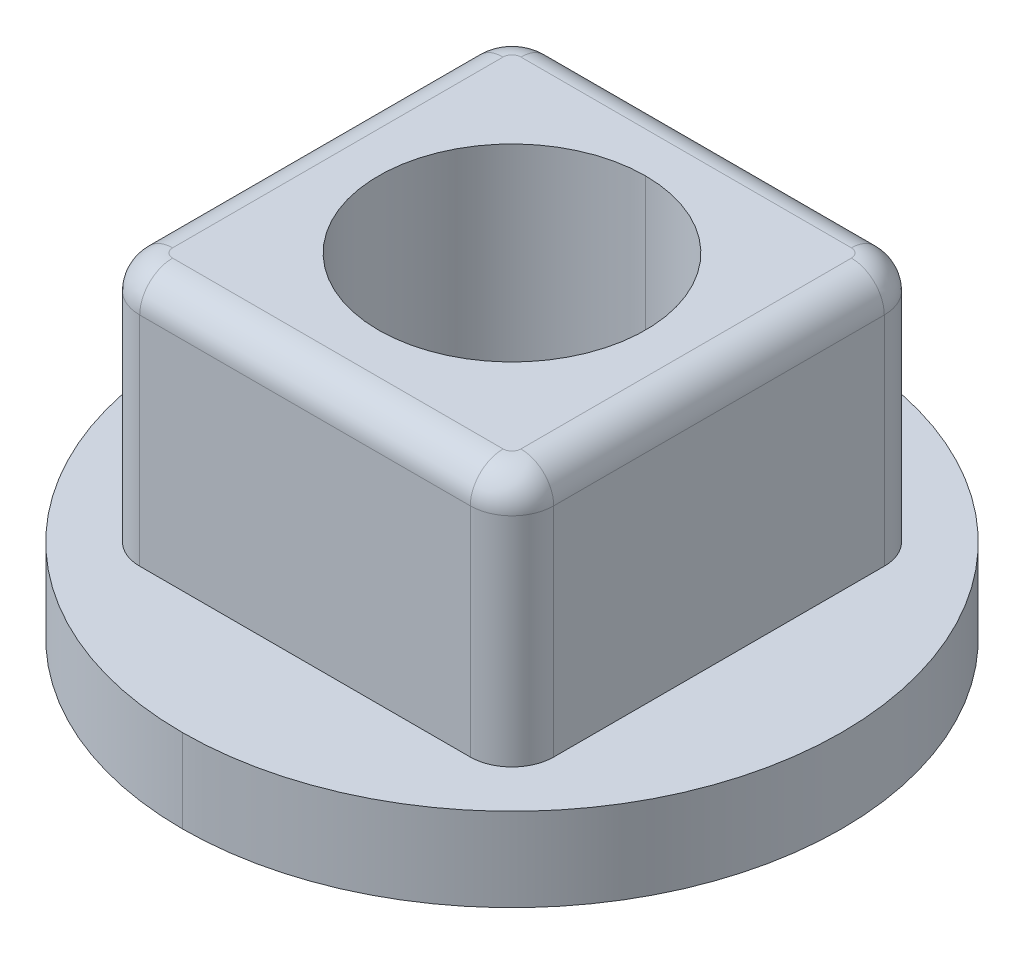
ISO-10303-21;
HEADER;
FILE_DESCRIPTION(('STEP AP214'),'2;1');
FILE_NAME('part.step','',(''),(''),'','','');
FILE_SCHEMA(('AUTOMOTIVE_DESIGN { 1 0 10303 214 1 1 1 1 }'));
ENDSEC;
DATA;
#1=APPLICATION_CONTEXT('core data for automotive mechanical design processes');
#2=APPLICATION_PROTOCOL_DEFINITION('international standard','automotive_design',2000,#1);
#3=PRODUCT_CONTEXT('',#1,'mechanical');
#4=PRODUCT('Part','Part','',(#3));
#5=PRODUCT_RELATED_PRODUCT_CATEGORY('part','',(#4));
#6=PRODUCT_DEFINITION_FORMATION('','',#4);
#7=PRODUCT_DEFINITION_CONTEXT('part definition',#1,'design');
#8=PRODUCT_DEFINITION('design','',#6,#7);
#9=PRODUCT_DEFINITION_SHAPE('','',#8);
#10=(LENGTH_UNIT() NAMED_UNIT(*) SI_UNIT(.MILLI.,.METRE.));
#11=(NAMED_UNIT(*) PLANE_ANGLE_UNIT() SI_UNIT($,.RADIAN.));
#12=(NAMED_UNIT(*) SI_UNIT($,.STERADIAN.) SOLID_ANGLE_UNIT());
#13=UNCERTAINTY_MEASURE_WITH_UNIT(LENGTH_MEASURE(1.E-05),#10,'distance_accuracy_value','');
#14=(GEOMETRIC_REPRESENTATION_CONTEXT(3) GLOBAL_UNCERTAINTY_ASSIGNED_CONTEXT((#13)) GLOBAL_UNIT_ASSIGNED_CONTEXT((#10,
#11,#12)) REPRESENTATION_CONTEXT('',''));
#15=CARTESIAN_POINT('',(0.,0.,0.));
#16=DIRECTION('',(0.,0.,1.));
#17=DIRECTION('',(1.,0.,0.));
#18=AXIS2_PLACEMENT_3D('',#15,#16,#17);
#19=CARTESIAN_POINT('',(-2.5146,5.08,-2.5146));
#20=DIRECTION('',(0.,-1.,0.));
#21=DIRECTION('',(0.,0.,-1.));
#22=AXIS2_PLACEMENT_3D('',#19,#20,#21);
#23=CYLINDRICAL_SURFACE('',#22,0.635);
#24=DIRECTION('',(0.,1.,0.));
#25=VECTOR('',#24,1.);
#26=CARTESIAN_POINT('',(-3.1496,5.08,-2.5146));
#27=LINE('',#26,#25);
#28=CARTESIAN_POINT('',(-3.1496,1.27,-2.5146));
#29=VERTEX_POINT('',#28);
#30=CARTESIAN_POINT('',(-3.1496,4.58,-2.5146));
#31=VERTEX_POINT('',#30);
#32=EDGE_CURVE('E11',#29,#31,#27,.T.);
#33=ORIENTED_EDGE('',*,*,#32,.T.);
#34=CARTESIAN_POINT('',(-2.5146,4.58,-2.5146));
#35=DIRECTION('',(0.,-1.,0.));
#36=DIRECTION('',(0.,0.,-1.));
#37=AXIS2_PLACEMENT_3D('',#34,#35,#36);
#38=CIRCLE('',#37,0.635);
#39=CARTESIAN_POINT('',(-2.51459999999995,4.58,-3.14960000000006));
#40=VERTEX_POINT('',#39);
#41=EDGE_CURVE('E233',#31,#40,#38,.T.);
#42=ORIENTED_EDGE('',*,*,#41,.T.);
#43=DIRECTION('',(0.,-1.,0.));
#44=VECTOR('',#43,1.);
#45=CARTESIAN_POINT('',(-2.5146,5.08,-3.1496));
#46=LINE('',#45,#44);
#47=CARTESIAN_POINT('',(-2.5146,1.27,-3.1496));
#48=VERTEX_POINT('',#47);
#49=EDGE_CURVE('E282',#40,#48,#46,.T.);
#50=ORIENTED_EDGE('',*,*,#49,.T.);
#51=CARTESIAN_POINT('',(-2.5146,1.27,-2.5146));
#52=DIRECTION('',(0.,1.,0.));
#53=DIRECTION('',(0.,0.,-1.));
#54=AXIS2_PLACEMENT_3D('',#51,#52,#53);
#55=CIRCLE('',#54,0.635);
#56=EDGE_CURVE('E265',#48,#29,#55,.T.);
#57=ORIENTED_EDGE('',*,*,#56,.T.);
#58=EDGE_LOOP('',(#33,#42,#50,#57));
#59=FACE_BOUND('',#58,.T.);
#60=ADVANCED_FACE('F17',(#59),#23,.T.);
#61=CARTESIAN_POINT('',(2.5146,5.08,-2.5146));
#62=DIRECTION('',(0.,-1.,0.));
#63=DIRECTION('',(0.,0.,-1.));
#64=AXIS2_PLACEMENT_3D('',#61,#62,#63);
#65=CYLINDRICAL_SURFACE('',#64,0.635);
#66=DIRECTION('',(0.,1.,0.));
#67=VECTOR('',#66,1.);
#68=CARTESIAN_POINT('',(2.5146,5.08,-3.1496));
#69=LINE('',#68,#67);
#70=CARTESIAN_POINT('',(2.5146,1.27,-3.1496));
#71=VERTEX_POINT('',#70);
#72=CARTESIAN_POINT('',(2.5146,4.58,-3.1496));
#73=VERTEX_POINT('',#72);
#74=EDGE_CURVE('E324',#71,#73,#69,.T.);
#75=ORIENTED_EDGE('',*,*,#74,.T.);
#76=CARTESIAN_POINT('',(2.5146,4.58,-2.5146));
#77=DIRECTION('',(0.,-1.,0.));
#78=DIRECTION('',(0.,0.,-1.));
#79=AXIS2_PLACEMENT_3D('',#76,#77,#78);
#80=CIRCLE('',#79,0.635);
#81=CARTESIAN_POINT('',(3.14960000000006,4.58,-2.5146));
#82=VERTEX_POINT('',#81);
#83=EDGE_CURVE('E288',#73,#82,#80,.T.);
#84=ORIENTED_EDGE('',*,*,#83,.T.);
#85=DIRECTION('',(0.,-1.,0.));
#86=VECTOR('',#85,1.);
#87=CARTESIAN_POINT('',(3.1496,5.08,-2.5146));
#88=LINE('',#87,#86);
#89=CARTESIAN_POINT('',(3.1496,1.27,-2.5146));
#90=VERTEX_POINT('',#89);
#91=EDGE_CURVE('E45',#82,#90,#88,.T.);
#92=ORIENTED_EDGE('',*,*,#91,.T.);
#93=CARTESIAN_POINT('',(2.5146,1.27,-2.5146));
#94=DIRECTION('',(0.,1.,0.));
#95=DIRECTION('',(0.,0.,-1.));
#96=AXIS2_PLACEMENT_3D('',#93,#94,#95);
#97=CIRCLE('',#96,0.635);
#98=EDGE_CURVE('E264',#90,#71,#97,.T.);
#99=ORIENTED_EDGE('',*,*,#98,.T.);
#100=EDGE_LOOP('',(#75,#84,#92,#99));
#101=FACE_BOUND('',#100,.T.);
#102=ADVANCED_FACE('F639',(#101),#65,.T.);
#103=CARTESIAN_POINT('',(2.5146,5.08,2.5146));
#104=DIRECTION('',(0.,-1.,0.));
#105=DIRECTION('',(0.,0.,-1.));
#106=AXIS2_PLACEMENT_3D('',#103,#104,#105);
#107=CYLINDRICAL_SURFACE('',#106,0.635);
#108=DIRECTION('',(0.,1.,0.));
#109=VECTOR('',#108,1.);
#110=CARTESIAN_POINT('',(3.1496,5.08,2.5146));
#111=LINE('',#110,#109);
#112=CARTESIAN_POINT('',(3.1496,1.27,2.5146));
#113=VERTEX_POINT('',#112);
#114=CARTESIAN_POINT('',(3.14959999999986,4.58,2.51460000000038));
#115=VERTEX_POINT('',#114);
#116=EDGE_CURVE('E129',#113,#115,#111,.T.);
#117=ORIENTED_EDGE('',*,*,#116,.T.);
#118=CARTESIAN_POINT('',(2.5146,4.58,2.5146));
#119=DIRECTION('',(0.,-1.,0.));
#120=DIRECTION('',(0.,0.,-1.));
#121=AXIS2_PLACEMENT_3D('',#118,#119,#120);
#122=CIRCLE('',#121,0.635);
#123=CARTESIAN_POINT('',(2.51459999999995,4.58,3.14960000000006));
#124=VERTEX_POINT('',#123);
#125=EDGE_CURVE('E192',#115,#124,#122,.T.);
#126=ORIENTED_EDGE('',*,*,#125,.T.);
#127=DIRECTION('',(0.,-1.,0.));
#128=VECTOR('',#127,1.);
#129=CARTESIAN_POINT('',(2.5146,5.08,3.1496));
#130=LINE('',#129,#128);
#131=CARTESIAN_POINT('',(2.5146,1.27,3.1496));
#132=VERTEX_POINT('',#131);
#133=EDGE_CURVE('E138',#124,#132,#130,.T.);
#134=ORIENTED_EDGE('',*,*,#133,.T.);
#135=CARTESIAN_POINT('',(2.5146,1.27,2.5146));
#136=DIRECTION('',(0.,1.,0.));
#137=DIRECTION('',(0.,0.,-1.));
#138=AXIS2_PLACEMENT_3D('',#135,#136,#137);
#139=CIRCLE('',#138,0.635);
#140=EDGE_CURVE('E253',#132,#113,#139,.T.);
#141=ORIENTED_EDGE('',*,*,#140,.T.);
#142=EDGE_LOOP('',(#117,#126,#134,#141));
#143=FACE_BOUND('',#142,.T.);
#144=ADVANCED_FACE('F340',(#143),#107,.T.);
#145=CARTESIAN_POINT('',(-2.5146,5.08,2.5146));
#146=DIRECTION('',(0.,-1.,0.));
#147=DIRECTION('',(0.,0.,-1.));
#148=AXIS2_PLACEMENT_3D('',#145,#146,#147);
#149=CYLINDRICAL_SURFACE('',#148,0.635);
#150=DIRECTION('',(0.,1.,0.));
#151=VECTOR('',#150,1.);
#152=CARTESIAN_POINT('',(-2.5146,5.08,3.1496));
#153=LINE('',#152,#151);
#154=CARTESIAN_POINT('',(-2.5146,1.27,3.1496));
#155=VERTEX_POINT('',#154);
#156=CARTESIAN_POINT('',(-2.5146,4.58,3.1496));
#157=VERTEX_POINT('',#156);
#158=EDGE_CURVE('E285',#155,#157,#153,.T.);
#159=ORIENTED_EDGE('',*,*,#158,.T.);
#160=CARTESIAN_POINT('',(-2.5146,4.58,2.5146));
#161=DIRECTION('',(0.,-1.,0.));
#162=DIRECTION('',(0.,0.,-1.));
#163=AXIS2_PLACEMENT_3D('',#160,#161,#162);
#164=CIRCLE('',#163,0.635);
#165=CARTESIAN_POINT('',(-3.14960000000006,4.58,2.51459999999995));
#166=VERTEX_POINT('',#165);
#167=EDGE_CURVE('E268',#157,#166,#164,.T.);
#168=ORIENTED_EDGE('',*,*,#167,.T.);
#169=DIRECTION('',(0.,-1.,0.));
#170=VECTOR('',#169,1.);
#171=CARTESIAN_POINT('',(-3.1496,5.08,2.5146));
#172=LINE('',#171,#170);
#173=CARTESIAN_POINT('',(-3.1496,1.27,2.5146));
#174=VERTEX_POINT('',#173);
#175=EDGE_CURVE('E30',#166,#174,#172,.T.);
#176=ORIENTED_EDGE('',*,*,#175,.T.);
#177=CARTESIAN_POINT('',(-2.5146,1.27,2.5146));
#178=DIRECTION('',(0.,1.,0.));
#179=DIRECTION('',(0.,0.,-1.));
#180=AXIS2_PLACEMENT_3D('',#177,#178,#179);
#181=CIRCLE('',#180,0.635);
#182=EDGE_CURVE('E333',#174,#155,#181,.T.);
#183=ORIENTED_EDGE('',*,*,#182,.T.);
#184=EDGE_LOOP('',(#159,#168,#176,#183));
#185=FACE_BOUND('',#184,.T.);
#186=ADVANCED_FACE('F566',(#185),#149,.T.);
#187=CARTESIAN_POINT('',(-3.1496,5.08,-3.1496));
#188=DIRECTION('',(1.,0.,0.));
#189=DIRECTION('',(0.,1.,0.));
#190=AXIS2_PLACEMENT_3D('',#187,#188,#189);
#191=PLANE('',#190);
#192=DIRECTION('',(0.,0.,-1.));
#193=VECTOR('',#192,1.);
#194=CARTESIAN_POINT('',(-3.1496,1.27,0.));
#195=LINE('',#194,#193);
#196=EDGE_CURVE('E310',#174,#29,#195,.T.);
#197=ORIENTED_EDGE('',*,*,#196,.F.);
#198=ORIENTED_EDGE('',*,*,#175,.F.);
#199=DIRECTION('',(0.,0.,1.));
#200=VECTOR('',#199,1.);
#201=CARTESIAN_POINT('',(-3.1496,4.58,2.538898108304));
#202=LINE('',#201,#200);
#203=EDGE_CURVE('E234',#31,#166,#202,.T.);
#204=ORIENTED_EDGE('',*,*,#203,.F.);
#205=ORIENTED_EDGE('',*,*,#32,.F.);
#206=EDGE_LOOP('',(#197,#198,#204,#205));
#207=FACE_BOUND('',#206,.T.);
#208=ADVANCED_FACE('F19',(#207),#191,.F.);
#209=CARTESIAN_POINT('',(-3.1496,5.08,-3.1496));
#210=DIRECTION('',(0.,0.,1.));
#211=DIRECTION('',(1.,0.,0.));
#212=AXIS2_PLACEMENT_3D('',#209,#210,#211);
#213=PLANE('',#212);
#214=DIRECTION('',(1.,0.,0.));
#215=VECTOR('',#214,1.);
#216=CARTESIAN_POINT('',(0.,1.27,-3.1496));
#217=LINE('',#216,#215);
#218=EDGE_CURVE('E260',#48,#71,#217,.T.);
#219=ORIENTED_EDGE('',*,*,#218,.F.);
#220=ORIENTED_EDGE('',*,*,#49,.F.);
#221=DIRECTION('',(-1.,0.,0.));
#222=VECTOR('',#221,1.);
#223=CARTESIAN_POINT('',(-2.538898108304,4.58,-3.1496));
#224=LINE('',#223,#222);
#225=EDGE_CURVE('E249',#73,#40,#224,.T.);
#226=ORIENTED_EDGE('',*,*,#225,.F.);
#227=ORIENTED_EDGE('',*,*,#74,.F.);
#228=EDGE_LOOP('',(#219,#220,#226,#227));
#229=FACE_BOUND('',#228,.T.);
#230=ADVANCED_FACE('F397',(#229),#213,.F.);
#231=CARTESIAN_POINT('',(3.1496,5.08,-3.1496));
#232=DIRECTION('',(-1.,0.,0.));
#233=DIRECTION('',(0.,0.,1.));
#234=AXIS2_PLACEMENT_3D('',#231,#232,#233);
#235=PLANE('',#234);
#236=DIRECTION('',(0.,0.,1.));
#237=VECTOR('',#236,1.);
#238=CARTESIAN_POINT('',(3.1496,1.27,0.));
#239=LINE('',#238,#237);
#240=EDGE_CURVE('E193',#90,#113,#239,.T.);
#241=ORIENTED_EDGE('',*,*,#240,.F.);
#242=ORIENTED_EDGE('',*,*,#91,.F.);
#243=DIRECTION('',(0.,0.,-1.));
#244=VECTOR('',#243,1.);
#245=CARTESIAN_POINT('',(3.1496,4.58,-2.538898108304));
#246=LINE('',#245,#244);
#247=EDGE_CURVE('E292',#115,#82,#246,.T.);
#248=ORIENTED_EDGE('',*,*,#247,.F.);
#249=ORIENTED_EDGE('',*,*,#116,.F.);
#250=EDGE_LOOP('',(#241,#242,#248,#249));
#251=FACE_BOUND('',#250,.T.);
#252=ADVANCED_FACE('F342',(#251),#235,.F.);
#253=CARTESIAN_POINT('',(-3.1496,5.08,3.1496));
#254=DIRECTION('',(0.,0.,-1.));
#255=DIRECTION('',(0.,-1.,0.));
#256=AXIS2_PLACEMENT_3D('',#253,#254,#255);
#257=PLANE('',#256);
#258=DIRECTION('',(-1.,0.,0.));
#259=VECTOR('',#258,1.);
#260=CARTESIAN_POINT('',(0.,1.27,3.1496));
#261=LINE('',#260,#259);
#262=EDGE_CURVE('E259',#132,#155,#261,.T.);
#263=ORIENTED_EDGE('',*,*,#262,.F.);
#264=ORIENTED_EDGE('',*,*,#133,.F.);
#265=DIRECTION('',(1.,0.,0.));
#266=VECTOR('',#265,1.);
#267=CARTESIAN_POINT('',(2.538898108304,4.58,3.1496));
#268=LINE('',#267,#266);
#269=EDGE_CURVE('E188',#157,#124,#268,.T.);
#270=ORIENTED_EDGE('',*,*,#269,.F.);
#271=ORIENTED_EDGE('',*,*,#158,.F.);
#272=EDGE_LOOP('',(#263,#264,#270,#271));
#273=FACE_BOUND('',#272,.T.);
#274=ADVANCED_FACE('F631',(#273),#257,.F.);
#275=CARTESIAN_POINT('',(2.6496,4.58,-2.538898108304));
#276=DIRECTION('',(0.,0.,1.));
#277=DIRECTION('',(1.,0.,0.));
#278=AXIS2_PLACEMENT_3D('',#275,#276,#277);
#279=CYLINDRICAL_SURFACE('',#278,0.5);
#280=CARTESIAN_POINT('',(2.64960000000073,4.58000000000137,2.51460000000035));
#281=DIRECTION('',(-8.1333087971954E-13,-1.54824070231327E-12,1.));
#282=DIRECTION('',(0.,-1.,-1.54824070231327E-12));
#283=AXIS2_PLACEMENT_3D('',#280,#281,#282);
#284=CIRCLE('',#283,0.499999999998719);
#285=CARTESIAN_POINT('',(2.64959999731337,5.08,2.51460000000056));
#286=VERTEX_POINT('',#285);
#287=EDGE_CURVE('E199',#115,#286,#284,.T.);
#288=ORIENTED_EDGE('',*,*,#287,.F.);
#289=ORIENTED_EDGE('',*,*,#247,.T.);
#290=CARTESIAN_POINT('',(2.64960000000085,4.58,-2.51459999999942));
#291=DIRECTION('',(-9.53885978662499E-13,-2.11289319374241E-12,-1.));
#292=DIRECTION('',(0.,1.,-2.11289319374241E-12));
#293=AXIS2_PLACEMENT_3D('',#290,#291,#292);
#294=CIRCLE('',#293,0.499999999999372);
#295=CARTESIAN_POINT('',(2.64959999731342,5.08,-2.51460000000024));
#296=VERTEX_POINT('',#295);
#297=EDGE_CURVE('E293',#296,#82,#294,.T.);
#298=ORIENTED_EDGE('',*,*,#297,.F.);
#299=DIRECTION('',(0.,0.,-1.));
#300=VECTOR('',#299,1.);
#301=CARTESIAN_POINT('',(2.649599994626,5.08,3.1496));
#302=LINE('',#301,#300);
#303=EDGE_CURVE('E204',#286,#296,#302,.T.);
#304=ORIENTED_EDGE('',*,*,#303,.F.);
#305=EDGE_LOOP('',(#288,#289,#298,#304));
#306=FACE_BOUND('',#305,.T.);
#307=ADVANCED_FACE('F346',(#306),#279,.T.);
#308=CARTESIAN_POINT('',(2.5146,4.58000000000152,-2.51459999999865));
#309=DIRECTION('',(0.,-1.,0.));
#310=DIRECTION('',(0.,0.,-1.));
#311=AXIS2_PLACEMENT_3D('',#308,#309,#310);
#312=DEGENERATE_TOROIDAL_SURFACE('',#311,0.135000000002099,0.499999999998586,.T.);
#313=ORIENTED_EDGE('',*,*,#297,.T.);
#314=ORIENTED_EDGE('',*,*,#83,.F.);
#315=CARTESIAN_POINT('',(2.5146,4.58,-2.6496));
#316=DIRECTION('',(-1.,0.,0.));
#317=DIRECTION('',(0.,0.,-1.));
#318=AXIS2_PLACEMENT_3D('',#315,#316,#317);
#319=CIRCLE('',#318,0.5);
#320=CARTESIAN_POINT('',(2.5146,5.08,-2.6496));
#321=VERTEX_POINT('',#320);
#322=EDGE_CURVE('E246',#321,#73,#319,.T.);
#323=ORIENTED_EDGE('',*,*,#322,.F.);
#324=CARTESIAN_POINT('',(2.64959999731342,5.08,-2.51460000000024));
#325=CARTESIAN_POINT('',(2.64929854124321,5.08,-2.55193340251838));
#326=CARTESIAN_POINT('',(2.63586943232832,5.08,-2.58400448345235));
#327=CARTESIAN_POINT('',(2.58424939099205,5.08,-2.63611434301605));
#328=CARTESIAN_POINT('',(2.55242958710532,5.08,-2.64929453860465));
#329=CARTESIAN_POINT('',(2.5146,5.08,-2.6496));
#330=(BOUNDED_CURVE() B_SPLINE_CURVE(3,(#324,#325,#326,#327,#328,#329),.UNSPECIFIED.,.F.,
.F.) B_SPLINE_CURVE_WITH_KNOTS((4,2,4),(0.,0.5,1.),
.UNSPECIFIED.) CURVE() GEOMETRIC_REPRESENTATION_ITEM() RATIONAL_B_SPLINE_CURVE((1.,1.,1.,1.,1.,1.)) REPRESENTATION_ITEM(''));
#331=EDGE_CURVE('E351',#296,#321,#330,.T.);
#332=ORIENTED_EDGE('',*,*,#331,.F.);
#333=EDGE_LOOP('',(#313,#314,#323,#332));
#334=FACE_BOUND('',#333,.T.);
#335=ADVANCED_FACE('F570',(#334),#312,.T.);
#336=CARTESIAN_POINT('',(-2.538898108304,4.58,-2.6496));
#337=DIRECTION('',(1.,0.,0.));
#338=DIRECTION('',(0.,0.,-1.));
#339=AXIS2_PLACEMENT_3D('',#336,#337,#338);
#340=CYLINDRICAL_SURFACE('',#339,0.5);
#341=ORIENTED_EDGE('',*,*,#322,.T.);
#342=ORIENTED_EDGE('',*,*,#225,.T.);
#343=CARTESIAN_POINT('',(-2.51459999999942,4.58,-2.64960000000085));
#344=DIRECTION('',(-1.,-2.11289319374241E-12,9.53885978662499E-13));
#345=DIRECTION('',(2.11289319374241E-12,-1.,0.));
#346=AXIS2_PLACEMENT_3D('',#343,#344,#345);
#347=CIRCLE('',#346,0.499999999999372);
#348=CARTESIAN_POINT('',(-2.51460000000024,5.08,-2.64959999731342));
#349=VERTEX_POINT('',#348);
#350=EDGE_CURVE('E229',#349,#40,#347,.T.);
#351=ORIENTED_EDGE('',*,*,#350,.F.);
#352=DIRECTION('',(-1.,0.,0.));
#353=VECTOR('',#352,1.);
#354=CARTESIAN_POINT('',(-3.1496,5.08,-2.6496));
#355=LINE('',#354,#353);
#356=EDGE_CURVE('E220',#321,#349,#355,.T.);
#357=ORIENTED_EDGE('',*,*,#356,.F.);
#358=EDGE_LOOP('',(#341,#342,#351,#357));
#359=FACE_BOUND('',#358,.T.);
#360=ADVANCED_FACE('F412',(#359),#340,.T.);
#361=CARTESIAN_POINT('',(-2.51459999999865,4.58000000000152,-2.5146));
#362=DIRECTION('',(0.,-1.,0.));
#363=DIRECTION('',(1.,0.,0.));
#364=AXIS2_PLACEMENT_3D('',#361,#362,#363);
#365=DEGENERATE_TOROIDAL_SURFACE('',#364,0.135000000002099,0.499999999998586,.T.);
#366=ORIENTED_EDGE('',*,*,#350,.T.);
#367=ORIENTED_EDGE('',*,*,#41,.F.);
#368=CARTESIAN_POINT('',(-2.6496,4.58,-2.5146));
#369=DIRECTION('',(0.,0.,1.));
#370=DIRECTION('',(-1.,0.,0.));
#371=AXIS2_PLACEMENT_3D('',#368,#369,#370);
#372=CIRCLE('',#371,0.5);
#373=CARTESIAN_POINT('',(-2.6496,5.08,-2.5146));
#374=VERTEX_POINT('',#373);
#375=EDGE_CURVE('E273',#374,#31,#372,.T.);
#376=ORIENTED_EDGE('',*,*,#375,.F.);
#377=CARTESIAN_POINT('',(-2.51460000000024,5.08,-2.64959999731342));
#378=CARTESIAN_POINT('',(-2.55193340251837,5.08,-2.64929854124321));
#379=CARTESIAN_POINT('',(-2.58400448345235,5.08,-2.63586943232831));
#380=CARTESIAN_POINT('',(-2.63611434301604,5.08,-2.58424939099207));
#381=CARTESIAN_POINT('',(-2.64929453860465,5.08,-2.55242958710534));
#382=CARTESIAN_POINT('',(-2.6496,5.08,-2.5146));
#383=(BOUNDED_CURVE() B_SPLINE_CURVE(3,(#377,#378,#379,#380,#381,#382),.UNSPECIFIED.,.F.,
.F.) B_SPLINE_CURVE_WITH_KNOTS((4,2,4),(0.,0.5,1.),
.UNSPECIFIED.) CURVE() GEOMETRIC_REPRESENTATION_ITEM() RATIONAL_B_SPLINE_CURVE((1.,1.,1.,1.,1.,1.)) REPRESENTATION_ITEM(''));
#384=EDGE_CURVE('E21',#349,#374,#383,.T.);
#385=ORIENTED_EDGE('',*,*,#384,.F.);
#386=EDGE_LOOP('',(#366,#367,#376,#385));
#387=FACE_BOUND('',#386,.T.);
#388=ADVANCED_FACE('F405',(#387),#365,.T.);
#389=CARTESIAN_POINT('',(-2.6496,4.58,2.538898108304));
#390=DIRECTION('',(0.,0.,-1.));
#391=DIRECTION('',(-1.,0.,0.));
#392=AXIS2_PLACEMENT_3D('',#389,#390,#391);
#393=CYLINDRICAL_SURFACE('',#392,0.5);
#394=ORIENTED_EDGE('',*,*,#375,.T.);
#395=ORIENTED_EDGE('',*,*,#203,.T.);
#396=CARTESIAN_POINT('',(-2.64960000000085,4.58,2.51459999999942));
#397=DIRECTION('',(9.53885978662499E-13,-2.11289319374241E-12,1.));
#398=DIRECTION('',(0.,-1.,-2.11289319374241E-12));
#399=AXIS2_PLACEMENT_3D('',#396,#397,#398);
#400=CIRCLE('',#399,0.499999999999372);
#401=CARTESIAN_POINT('',(-2.64959999731342,5.08,2.51460000000024));
#402=VERTEX_POINT('',#401);
#403=EDGE_CURVE('E151',#402,#166,#400,.T.);
#404=ORIENTED_EDGE('',*,*,#403,.F.);
#405=DIRECTION('',(0.,0.,1.));
#406=VECTOR('',#405,1.);
#407=CARTESIAN_POINT('',(-2.6496,5.08,3.1496));
#408=LINE('',#407,#406);
#409=EDGE_CURVE('E226',#374,#402,#408,.T.);
#410=ORIENTED_EDGE('',*,*,#409,.F.);
#411=EDGE_LOOP('',(#394,#395,#404,#410));
#412=FACE_BOUND('',#411,.T.);
#413=ADVANCED_FACE('F591',(#412),#393,.T.);
#414=CARTESIAN_POINT('',(-2.5146,4.58000000000152,2.51459999999865));
#415=DIRECTION('',(0.,-1.,0.));
#416=DIRECTION('',(0.,0.,-1.));
#417=AXIS2_PLACEMENT_3D('',#414,#415,#416);
#418=DEGENERATE_TOROIDAL_SURFACE('',#417,0.135000000002099,0.499999999998586,.T.);
#419=ORIENTED_EDGE('',*,*,#403,.T.);
#420=ORIENTED_EDGE('',*,*,#167,.F.);
#421=CARTESIAN_POINT('',(-2.5146,4.58,2.6496));
#422=DIRECTION('',(1.,0.,0.));
#423=DIRECTION('',(0.,0.,1.));
#424=AXIS2_PLACEMENT_3D('',#421,#422,#423);
#425=CIRCLE('',#424,0.5);
#426=CARTESIAN_POINT('',(-2.5146,5.08,2.6496));
#427=VERTEX_POINT('',#426);
#428=EDGE_CURVE('E223',#427,#157,#425,.T.);
#429=ORIENTED_EDGE('',*,*,#428,.F.);
#430=CARTESIAN_POINT('',(-2.64959999731342,5.08,2.51460000000024));
#431=CARTESIAN_POINT('',(-2.64929854124321,5.08,2.55193340251838));
#432=CARTESIAN_POINT('',(-2.63586943232832,5.08,2.58400448345235));
#433=CARTESIAN_POINT('',(-2.58424939099205,5.08,2.63611434301604));
#434=CARTESIAN_POINT('',(-2.55242958710532,5.08,2.64929453860465));
#435=CARTESIAN_POINT('',(-2.5146,5.08,2.6496));
#436=(BOUNDED_CURVE() B_SPLINE_CURVE(3,(#430,#431,#432,#433,#434,#435),.UNSPECIFIED.,.F.,
.F.) B_SPLINE_CURVE_WITH_KNOTS((4,2,4),(0.,0.5,1.),
.UNSPECIFIED.) CURVE() GEOMETRIC_REPRESENTATION_ITEM() RATIONAL_B_SPLINE_CURVE((1.,1.,1.,1.,1.,1.)) REPRESENTATION_ITEM(''));
#437=EDGE_CURVE('E209',#402,#427,#436,.T.);
#438=ORIENTED_EDGE('',*,*,#437,.F.);
#439=EDGE_LOOP('',(#419,#420,#429,#438));
#440=FACE_BOUND('',#439,.T.);
#441=ADVANCED_FACE('F587',(#440),#418,.T.);
#442=CARTESIAN_POINT('',(2.538898108304,4.58,2.6496));
#443=DIRECTION('',(-1.,0.,0.));
#444=DIRECTION('',(0.,0.,1.));
#445=AXIS2_PLACEMENT_3D('',#442,#443,#444);
#446=CYLINDRICAL_SURFACE('',#445,0.5);
#447=ORIENTED_EDGE('',*,*,#428,.T.);
#448=ORIENTED_EDGE('',*,*,#269,.T.);
#449=CARTESIAN_POINT('',(2.51459999999942,4.58,2.64960000000085));
#450=DIRECTION('',(1.,-2.11289319374241E-12,-9.53885978662499E-13));
#451=DIRECTION('',(2.11289319374241E-12,1.,0.));
#452=AXIS2_PLACEMENT_3D('',#449,#450,#451);
#453=CIRCLE('',#452,0.499999999999372);
#454=CARTESIAN_POINT('',(2.51460000000024,5.08,2.64959999731342));
#455=VERTEX_POINT('',#454);
#456=EDGE_CURVE('E181',#455,#124,#453,.T.);
#457=ORIENTED_EDGE('',*,*,#456,.F.);
#458=DIRECTION('',(1.,0.,0.));
#459=VECTOR('',#458,1.);
#460=CARTESIAN_POINT('',(-3.1496,5.08,2.6496));
#461=LINE('',#460,#459);
#462=EDGE_CURVE('E186',#427,#455,#461,.T.);
#463=ORIENTED_EDGE('',*,*,#462,.F.);
#464=EDGE_LOOP('',(#447,#448,#457,#463));
#465=FACE_BOUND('',#464,.T.);
#466=ADVANCED_FACE('F184',(#465),#446,.T.);
#467=CARTESIAN_POINT('',(2.51459999999865,4.58000000000152,2.5146));
#468=DIRECTION('',(0.,-1.,0.));
#469=DIRECTION('',(1.,0.,0.));
#470=AXIS2_PLACEMENT_3D('',#467,#468,#469);
#471=DEGENERATE_TOROIDAL_SURFACE('',#470,0.135000000002099,0.499999999998586,.T.);
#472=ORIENTED_EDGE('',*,*,#456,.T.);
#473=ORIENTED_EDGE('',*,*,#125,.F.);
#474=ORIENTED_EDGE('',*,*,#287,.T.);
#475=CARTESIAN_POINT('',(2.51460000000024,5.08,2.64959999731342));
#476=CARTESIAN_POINT('',(2.55193340250638,5.08,2.64929854124321));
#477=CARTESIAN_POINT('',(2.58400448290577,5.08,2.63586943232832));
#478=CARTESIAN_POINT('',(2.63611434041461,5.08,2.58424939099205));
#479=CARTESIAN_POINT('',(2.64929453473655,5.08,2.55242958710533));
#480=CARTESIAN_POINT('',(2.64959999731337,5.08,2.51460000000056));
#481=(BOUNDED_CURVE() B_SPLINE_CURVE(3,(#475,#476,#477,#478,#479,#480),.UNSPECIFIED.,.F.,
.F.) B_SPLINE_CURVE_WITH_KNOTS((4,2,4),(0.,0.5,1.),
.UNSPECIFIED.) CURVE() GEOMETRIC_REPRESENTATION_ITEM() RATIONAL_B_SPLINE_CURVE((1.,1.,1.,1.,1.,1.)) REPRESENTATION_ITEM(''));
#482=EDGE_CURVE('E196',#455,#286,#481,.T.);
#483=ORIENTED_EDGE('',*,*,#482,.F.);
#484=EDGE_LOOP('',(#472,#473,#474,#483));
#485=FACE_BOUND('',#484,.T.);
#486=ADVANCED_FACE('F197',(#485),#471,.T.);
#487=CARTESIAN_POINT('',(0.,1.27,0.));
#488=DIRECTION('',(0.,1.,0.));
#489=DIRECTION('',(1.,0.,0.));
#490=AXIS2_PLACEMENT_3D('',#487,#488,#489);
#491=PLANE('',#490);
#492=ORIENTED_EDGE('',*,*,#140,.F.);
#493=ORIENTED_EDGE('',*,*,#262,.T.);
#494=ORIENTED_EDGE('',*,*,#182,.F.);
#495=ORIENTED_EDGE('',*,*,#196,.T.);
#496=ORIENTED_EDGE('',*,*,#56,.F.);
#497=ORIENTED_EDGE('',*,*,#218,.T.);
#498=ORIENTED_EDGE('',*,*,#98,.F.);
#499=ORIENTED_EDGE('',*,*,#240,.T.);
#500=EDGE_LOOP('',(#492,#493,#494,#495,#496,#497,#498,#499));
#501=FACE_BOUND('',#500,.T.);
#502=CARTESIAN_POINT('',(0.,1.27,0.));
#503=DIRECTION('',(0.,-1.,0.));
#504=DIRECTION('',(0.,0.,-1.));
#505=AXIS2_PLACEMENT_3D('',#502,#503,#504);
#506=CIRCLE('',#505,5.0165);
#507=CARTESIAN_POINT('',(0.,1.27,-5.0165));
#508=VERTEX_POINT('',#507);
#509=CARTESIAN_POINT('',(0.,1.27,5.0165));
#510=VERTEX_POINT('',#509);
#511=EDGE_CURVE('E294',#508,#510,#506,.T.);
#512=ORIENTED_EDGE('',*,*,#511,.F.);
#513=CARTESIAN_POINT('',(0.,1.27,0.));
#514=DIRECTION('',(0.,-1.,0.));
#515=DIRECTION('',(0.,0.,-1.));
#516=AXIS2_PLACEMENT_3D('',#513,#514,#515);
#517=CIRCLE('',#516,5.0165);
#518=EDGE_CURVE('E211',#510,#508,#517,.T.);
#519=ORIENTED_EDGE('',*,*,#518,.F.);
#520=EDGE_LOOP('',(#512,#519));
#521=FACE_BOUND('',#520,.T.);
#522=ADVANCED_FACE('F399',(#501,#521),#491,.T.);
#523=CARTESIAN_POINT('',(-3.1496,5.08,3.1496));
#524=DIRECTION('',(0.,1.,0.));
#525=DIRECTION('',(1.,0.,0.));
#526=AXIS2_PLACEMENT_3D('',#523,#524,#525);
#527=PLANE('',#526);
#528=CARTESIAN_POINT('',(0.,5.08,0.));
#529=DIRECTION('',(0.,-1.,0.));
#530=DIRECTION('',(0.,0.,-1.));
#531=AXIS2_PLACEMENT_3D('',#528,#529,#530);
#532=CIRCLE('',#531,2.032);
#533=CARTESIAN_POINT('',(0.,5.08,-2.032));
#534=VERTEX_POINT('',#533);
#535=CARTESIAN_POINT('',(0.,5.08,2.032));
#536=VERTEX_POINT('',#535);
#537=EDGE_CURVE('E217',#534,#536,#532,.T.);
#538=ORIENTED_EDGE('',*,*,#537,.T.);
#539=CARTESIAN_POINT('',(0.,5.08,0.));
#540=DIRECTION('',(0.,-1.,0.));
#541=DIRECTION('',(0.,0.,-1.));
#542=AXIS2_PLACEMENT_3D('',#539,#540,#541);
#543=CIRCLE('',#542,2.032);
#544=EDGE_CURVE('E240',#536,#534,#543,.T.);
#545=ORIENTED_EDGE('',*,*,#544,.T.);
#546=EDGE_LOOP('',(#538,#545));
#547=FACE_BOUND('',#546,.T.);
#548=ORIENTED_EDGE('',*,*,#462,.T.);
#549=ORIENTED_EDGE('',*,*,#482,.T.);
#550=ORIENTED_EDGE('',*,*,#303,.T.);
#551=ORIENTED_EDGE('',*,*,#331,.T.);
#552=ORIENTED_EDGE('',*,*,#356,.T.);
#553=ORIENTED_EDGE('',*,*,#384,.T.);
#554=ORIENTED_EDGE('',*,*,#409,.T.);
#555=ORIENTED_EDGE('',*,*,#437,.T.);
#556=EDGE_LOOP('',(#548,#549,#550,#551,#552,#553,#554,#555));
#557=FACE_BOUND('',#556,.T.);
#558=ADVANCED_FACE('F207',(#547,#557),#527,.T.);
#559=CARTESIAN_POINT('',(0.,1.27,0.));
#560=DIRECTION('',(0.,-1.,0.));
#561=DIRECTION('',(0.,0.,-1.));
#562=AXIS2_PLACEMENT_3D('',#559,#560,#561);
#563=CYLINDRICAL_SURFACE('',#562,5.0165);
#564=DIRECTION('',(0.,-1.,0.));
#565=VECTOR('',#564,1.);
#566=CARTESIAN_POINT('',(0.,1.27,5.0165));
#567=LINE('',#566,#565);
#568=CARTESIAN_POINT('',(0.,0.,5.0165));
#569=VERTEX_POINT('',#568);
#570=EDGE_CURVE('E298',#510,#569,#567,.T.);
#571=ORIENTED_EDGE('',*,*,#570,.F.);
#572=ORIENTED_EDGE('',*,*,#518,.T.);
#573=DIRECTION('',(0.,-1.,0.));
#574=VECTOR('',#573,1.);
#575=CARTESIAN_POINT('',(0.,1.27,-5.0165));
#576=LINE('',#575,#574);
#577=CARTESIAN_POINT('',(0.,0.,-5.0165));
#578=VERTEX_POINT('',#577);
#579=EDGE_CURVE('E314',#508,#578,#576,.T.);
#580=ORIENTED_EDGE('',*,*,#579,.T.);
#581=CARTESIAN_POINT('',(0.,0.,0.));
#582=DIRECTION('',(0.,1.,0.));
#583=DIRECTION('',(0.,0.,-1.));
#584=AXIS2_PLACEMENT_3D('',#581,#582,#583);
#585=CIRCLE('',#584,5.0165);
#586=EDGE_CURVE('E318',#578,#569,#585,.T.);
#587=ORIENTED_EDGE('',*,*,#586,.T.);
#588=EDGE_LOOP('',(#571,#572,#580,#587));
#589=FACE_BOUND('',#588,.T.);
#590=ADVANCED_FACE('F581',(#589),#563,.T.);
#591=CARTESIAN_POINT('',(0.,0.,0.));
#592=DIRECTION('',(0.,-1.,0.));
#593=DIRECTION('',(0.,0.,-1.));
#594=AXIS2_PLACEMENT_3D('',#591,#592,#593);
#595=CYLINDRICAL_SURFACE('',#594,2.032);
#596=DIRECTION('',(0.,-1.,0.));
#597=VECTOR('',#596,1.);
#598=CARTESIAN_POINT('',(0.,0.,2.032));
#599=LINE('',#598,#597);
#600=CARTESIAN_POINT('',(0.,0.,2.032));
#601=VERTEX_POINT('',#600);
#602=EDGE_CURVE('E235',#536,#601,#599,.T.);
#603=ORIENTED_EDGE('',*,*,#602,.F.);
#604=ORIENTED_EDGE('',*,*,#537,.F.);
#605=DIRECTION('',(0.,-1.,0.));
#606=VECTOR('',#605,1.);
#607=CARTESIAN_POINT('',(0.,0.,-2.032));
#608=LINE('',#607,#606);
#609=CARTESIAN_POINT('',(0.,0.,-2.032));
#610=VERTEX_POINT('',#609);
#611=EDGE_CURVE('E299',#534,#610,#608,.T.);
#612=ORIENTED_EDGE('',*,*,#611,.T.);
#613=CARTESIAN_POINT('',(0.,0.,0.));
#614=DIRECTION('',(0.,-1.,0.));
#615=DIRECTION('',(0.,0.,-1.));
#616=AXIS2_PLACEMENT_3D('',#613,#614,#615);
#617=CIRCLE('',#616,2.032);
#618=EDGE_CURVE('E359',#610,#601,#617,.T.);
#619=ORIENTED_EDGE('',*,*,#618,.T.);
#620=EDGE_LOOP('',(#603,#604,#612,#619));
#621=FACE_BOUND('',#620,.T.);
#622=ADVANCED_FACE('F611',(#621),#595,.F.);
#623=CARTESIAN_POINT('',(0.,0.,0.));
#624=DIRECTION('',(0.,1.,0.));
#625=DIRECTION('',(1.,0.,0.));
#626=AXIS2_PLACEMENT_3D('',#623,#624,#625);
#627=PLANE('',#626);
#628=ORIENTED_EDGE('',*,*,#618,.F.);
#629=CARTESIAN_POINT('',(0.,0.,0.));
#630=DIRECTION('',(0.,-1.,0.));
#631=DIRECTION('',(0.,0.,-1.));
#632=AXIS2_PLACEMENT_3D('',#629,#630,#631);
#633=CIRCLE('',#632,2.032);
#634=EDGE_CURVE('E239',#601,#610,#633,.T.);
#635=ORIENTED_EDGE('',*,*,#634,.F.);
#636=EDGE_LOOP('',(#628,#635));
#637=FACE_BOUND('',#636,.T.);
#638=ORIENTED_EDGE('',*,*,#586,.F.);
#639=CARTESIAN_POINT('',(0.,0.,0.));
#640=DIRECTION('',(0.,1.,0.));
#641=DIRECTION('',(0.,0.,-1.));
#642=AXIS2_PLACEMENT_3D('',#639,#640,#641);
#643=CIRCLE('',#642,5.0165);
#644=EDGE_CURVE('E306',#569,#578,#643,.T.);
#645=ORIENTED_EDGE('',*,*,#644,.F.);
#646=EDGE_LOOP('',(#638,#645));
#647=FACE_BOUND('',#646,.T.);
#648=ADVANCED_FACE('F615',(#637,#647),#627,.F.);
#649=CARTESIAN_POINT('',(0.,1.27,0.));
#650=DIRECTION('',(0.,-1.,0.));
#651=DIRECTION('',(0.,0.,-1.));
#652=AXIS2_PLACEMENT_3D('',#649,#650,#651);
#653=CYLINDRICAL_SURFACE('',#652,5.0165);
#654=ORIENTED_EDGE('',*,*,#511,.T.);
#655=ORIENTED_EDGE('',*,*,#570,.T.);
#656=ORIENTED_EDGE('',*,*,#644,.T.);
#657=ORIENTED_EDGE('',*,*,#579,.F.);
#658=EDGE_LOOP('',(#654,#655,#656,#657));
#659=FACE_BOUND('',#658,.T.);
#660=ADVANCED_FACE('F654',(#659),#653,.T.);
#661=CARTESIAN_POINT('',(0.,0.,0.));
#662=DIRECTION('',(0.,-1.,0.));
#663=DIRECTION('',(0.,0.,-1.));
#664=AXIS2_PLACEMENT_3D('',#661,#662,#663);
#665=CYLINDRICAL_SURFACE('',#664,2.032);
#666=ORIENTED_EDGE('',*,*,#544,.F.);
#667=ORIENTED_EDGE('',*,*,#602,.T.);
#668=ORIENTED_EDGE('',*,*,#634,.T.);
#669=ORIENTED_EDGE('',*,*,#611,.F.);
#670=EDGE_LOOP('',(#666,#667,#668,#669));
#671=FACE_BOUND('',#670,.T.);
#672=ADVANCED_FACE('F663',(#671),#665,.F.);
#673=CLOSED_SHELL('',(#60,#102,#144,#186,#208,#230,#252,#274,#307,#335,#360,#388,#413,#441,#466,
#486,#522,#558,#590,#622,#648,#660,#672));
#674=MANIFOLD_SOLID_BREP('B1',#673);
#675=ADVANCED_BREP_SHAPE_REPRESENTATION('',(#18,#674),#14);
#676=SHAPE_DEFINITION_REPRESENTATION(#9,#675);
ENDSEC;
END-ISO-10303-21;
